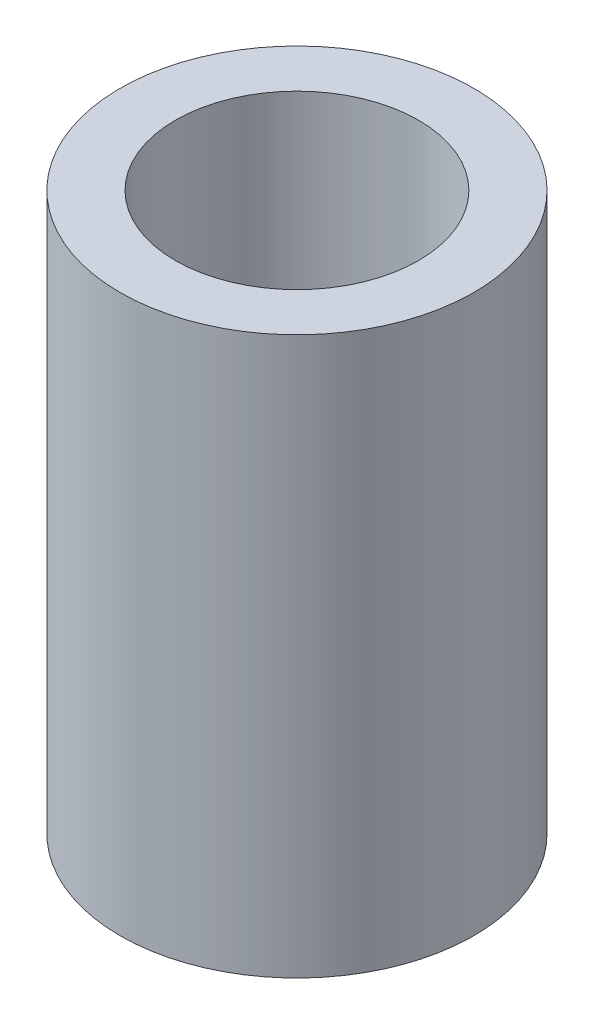
ISO-10303-21;
HEADER;
FILE_DESCRIPTION(('STEP AP214'),'2;1');
FILE_NAME('part.step','',(''),(''),'','','');
FILE_SCHEMA(('AUTOMOTIVE_DESIGN { 1 0 10303 214 1 1 1 1 }'));
ENDSEC;
DATA;
#1=APPLICATION_CONTEXT('core data for automotive mechanical design processes');
#2=APPLICATION_PROTOCOL_DEFINITION('international standard','automotive_design',2000,#1);
#3=PRODUCT_CONTEXT('',#1,'mechanical');
#4=PRODUCT('Part','Part','',(#3));
#5=PRODUCT_RELATED_PRODUCT_CATEGORY('part','',(#4));
#6=PRODUCT_DEFINITION_FORMATION('','',#4);
#7=PRODUCT_DEFINITION_CONTEXT('part definition',#1,'design');
#8=PRODUCT_DEFINITION('design','',#6,#7);
#9=PRODUCT_DEFINITION_SHAPE('','',#8);
#10=(LENGTH_UNIT() NAMED_UNIT(*) SI_UNIT(.MILLI.,.METRE.));
#11=(NAMED_UNIT(*) PLANE_ANGLE_UNIT() SI_UNIT($,.RADIAN.));
#12=(NAMED_UNIT(*) SI_UNIT($,.STERADIAN.) SOLID_ANGLE_UNIT());
#13=UNCERTAINTY_MEASURE_WITH_UNIT(LENGTH_MEASURE(1.E-05),#10,'distance_accuracy_value','');
#14=(GEOMETRIC_REPRESENTATION_CONTEXT(3) GLOBAL_UNCERTAINTY_ASSIGNED_CONTEXT((#13)) GLOBAL_UNIT_ASSIGNED_CONTEXT((#10,
#11,#12)) REPRESENTATION_CONTEXT('',''));
#15=CARTESIAN_POINT('',(0.,0.,0.));
#16=DIRECTION('',(0.,0.,1.));
#17=DIRECTION('',(1.,0.,0.));
#18=AXIS2_PLACEMENT_3D('',#15,#16,#17);
#19=CARTESIAN_POINT('',(0.,12.6,0.));
#20=DIRECTION('',(0.,1.,0.));
#21=DIRECTION('',(0.,0.,1.));
#22=AXIS2_PLACEMENT_3D('',#19,#20,#21);
#23=PLANE('',#22);
#24=CARTESIAN_POINT('',(0.,12.6,0.));
#25=DIRECTION('',(0.,1.,0.));
#26=DIRECTION('',(0.,0.,1.));
#27=AXIS2_PLACEMENT_3D('',#24,#25,#26);
#28=CIRCLE('',#27,4.);
#29=CARTESIAN_POINT('',(0.,12.6,4.));
#30=VERTEX_POINT('',#29);
#31=EDGE_CURVE('E10',#30,#30,#28,.T.);
#32=ORIENTED_EDGE('',*,*,#31,.T.);
#33=EDGE_LOOP('',(#32));
#34=FACE_BOUND('',#33,.T.);
#35=CARTESIAN_POINT('',(0.,12.6,0.));
#36=DIRECTION('',(0.,1.,0.));
#37=DIRECTION('',(0.,0.,1.));
#38=AXIS2_PLACEMENT_3D('',#35,#36,#37);
#39=CIRCLE('',#38,2.75);
#40=CARTESIAN_POINT('',(0.,12.6,2.75));
#41=VERTEX_POINT('',#40);
#42=EDGE_CURVE('E43',#41,#41,#39,.T.);
#43=ORIENTED_EDGE('',*,*,#42,.F.);
#44=EDGE_LOOP('',(#43));
#45=FACE_BOUND('',#44,.T.);
#46=ADVANCED_FACE('F32',(#34,#45),#23,.T.);
#47=CARTESIAN_POINT('',(0.,0.,0.));
#48=DIRECTION('',(0.,1.,0.));
#49=DIRECTION('',(0.,0.,1.));
#50=AXIS2_PLACEMENT_3D('',#47,#48,#49);
#51=PLANE('',#50);
#52=CARTESIAN_POINT('',(0.,0.,0.));
#53=DIRECTION('',(0.,1.,0.));
#54=DIRECTION('',(0.,0.,1.));
#55=AXIS2_PLACEMENT_3D('',#52,#53,#54);
#56=CIRCLE('',#55,4.);
#57=CARTESIAN_POINT('',(0.,0.,4.));
#58=VERTEX_POINT('',#57);
#59=EDGE_CURVE('E36',#58,#58,#56,.T.);
#60=ORIENTED_EDGE('',*,*,#59,.F.);
#61=EDGE_LOOP('',(#60));
#62=FACE_BOUND('',#61,.T.);
#63=CARTESIAN_POINT('',(0.,0.,0.));
#64=DIRECTION('',(0.,1.,0.));
#65=DIRECTION('',(0.,0.,1.));
#66=AXIS2_PLACEMENT_3D('',#63,#64,#65);
#67=CIRCLE('',#66,2.75);
#68=CARTESIAN_POINT('',(0.,0.,2.75));
#69=VERTEX_POINT('',#68);
#70=EDGE_CURVE('E45',#69,#69,#67,.T.);
#71=ORIENTED_EDGE('',*,*,#70,.T.);
#72=EDGE_LOOP('',(#71));
#73=FACE_BOUND('',#72,.T.);
#74=ADVANCED_FACE('F55',(#62,#73),#51,.F.);
#75=CARTESIAN_POINT('',(0.,12.6,0.));
#76=DIRECTION('',(0.,-1.,0.));
#77=DIRECTION('',(0.,0.,-1.));
#78=AXIS2_PLACEMENT_3D('',#75,#76,#77);
#79=CYLINDRICAL_SURFACE('',#78,4.);
#80=ORIENTED_EDGE('',*,*,#31,.F.);
#81=EDGE_LOOP('',(#80));
#82=FACE_BOUND('',#81,.T.);
#83=ORIENTED_EDGE('',*,*,#59,.T.);
#84=EDGE_LOOP('',(#83));
#85=FACE_BOUND('',#84,.T.);
#86=ADVANCED_FACE('F34',(#82,#85),#79,.T.);
#87=CARTESIAN_POINT('',(0.,12.6,0.));
#88=DIRECTION('',(0.,-1.,0.));
#89=DIRECTION('',(0.,0.,-1.));
#90=AXIS2_PLACEMENT_3D('',#87,#88,#89);
#91=CYLINDRICAL_SURFACE('',#90,2.75);
#92=ORIENTED_EDGE('',*,*,#42,.T.);
#93=EDGE_LOOP('',(#92));
#94=FACE_BOUND('',#93,.T.);
#95=ORIENTED_EDGE('',*,*,#70,.F.);
#96=EDGE_LOOP('',(#95));
#97=FACE_BOUND('',#96,.T.);
#98=ADVANCED_FACE('F51',(#94,#97),#91,.F.);
#99=CLOSED_SHELL('',(#46,#74,#86,#98));
#100=MANIFOLD_SOLID_BREP('B2',#99);
#101=ADVANCED_BREP_SHAPE_REPRESENTATION('',(#18,#100),#14);
#102=SHAPE_DEFINITION_REPRESENTATION(#9,#101);
ENDSEC;
END-ISO-10303-21;
